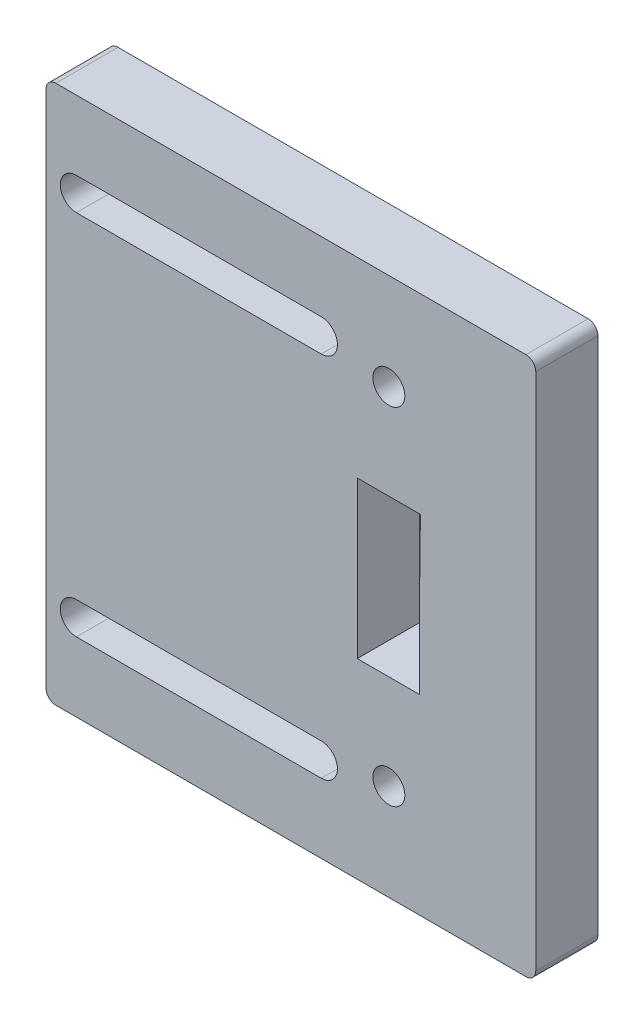
ISO-10303-21;
HEADER;
FILE_DESCRIPTION(('STEP AP214'),'2;1');
FILE_NAME('part.step','',(''),(''),'','','');
FILE_SCHEMA(('AUTOMOTIVE_DESIGN { 1 0 10303 214 1 1 1 1 }'));
ENDSEC;
DATA;
#1=APPLICATION_CONTEXT('core data for automotive mechanical design processes');
#2=APPLICATION_PROTOCOL_DEFINITION('international standard','automotive_design',2000,#1);
#3=PRODUCT_CONTEXT('',#1,'mechanical');
#4=PRODUCT('Part','Part','',(#3));
#5=PRODUCT_RELATED_PRODUCT_CATEGORY('part','',(#4));
#6=PRODUCT_DEFINITION_FORMATION('','',#4);
#7=PRODUCT_DEFINITION_CONTEXT('part definition',#1,'design');
#8=PRODUCT_DEFINITION('design','',#6,#7);
#9=PRODUCT_DEFINITION_SHAPE('','',#8);
#10=(LENGTH_UNIT() NAMED_UNIT(*) SI_UNIT(.MILLI.,.METRE.));
#11=(NAMED_UNIT(*) PLANE_ANGLE_UNIT() SI_UNIT($,.RADIAN.));
#12=(NAMED_UNIT(*) SI_UNIT($,.STERADIAN.) SOLID_ANGLE_UNIT());
#13=UNCERTAINTY_MEASURE_WITH_UNIT(LENGTH_MEASURE(1.E-05),#10,'distance_accuracy_value','');
#14=(GEOMETRIC_REPRESENTATION_CONTEXT(3) GLOBAL_UNCERTAINTY_ASSIGNED_CONTEXT((#13)) GLOBAL_UNIT_ASSIGNED_CONTEXT((#10,
#11,#12)) REPRESENTATION_CONTEXT('',''));
#15=CARTESIAN_POINT('',(0.,0.,0.));
#16=DIRECTION('',(0.,0.,1.));
#17=DIRECTION('',(1.,0.,0.));
#18=AXIS2_PLACEMENT_3D('',#15,#16,#17);
#19=CARTESIAN_POINT('',(0.,0.,12.7));
#20=DIRECTION('',(0.,0.,1.));
#21=DIRECTION('',(1.,0.,0.));
#22=AXIS2_PLACEMENT_3D('',#19,#20,#21);
#23=PLANE('',#22);
#24=CARTESIAN_POINT('',(56.200253658406,-17.49,12.7));
#25=DIRECTION('',(0.,0.,-1.));
#26=DIRECTION('',(1.,0.,0.));
#27=AXIS2_PLACEMENT_3D('',#24,#25,#26);
#28=CIRCLE('',#27,3.3);
#29=CARTESIAN_POINT('',(56.200253658406,-14.19,12.7));
#30=VERTEX_POINT('',#29);
#31=CARTESIAN_POINT('',(56.200253658406,-20.79,12.7));
#32=VERTEX_POINT('',#31);
#33=EDGE_CURVE('E187',#30,#32,#28,.T.);
#34=ORIENTED_EDGE('',*,*,#33,.T.);
#35=DIRECTION('',(-1.,0.,0.));
#36=VECTOR('',#35,1.);
#37=CARTESIAN_POINT('',(56.200253658406,-20.79,12.7));
#38=LINE('',#37,#36);
#39=CARTESIAN_POINT('',(6.20025365840605,-20.79,12.7));
#40=VERTEX_POINT('',#39);
#41=EDGE_CURVE('E199',#32,#40,#38,.T.);
#42=ORIENTED_EDGE('',*,*,#41,.T.);
#43=CARTESIAN_POINT('',(6.20025365840605,-17.49,12.7));
#44=DIRECTION('',(0.,0.,-1.));
#45=DIRECTION('',(1.,0.,0.));
#46=AXIS2_PLACEMENT_3D('',#43,#44,#45);
#47=CIRCLE('',#46,3.3);
#48=CARTESIAN_POINT('',(6.20025365840605,-14.19,12.7));
#49=VERTEX_POINT('',#48);
#50=EDGE_CURVE('E55',#40,#49,#47,.T.);
#51=ORIENTED_EDGE('',*,*,#50,.T.);
#52=DIRECTION('',(1.,0.,0.));
#53=VECTOR('',#52,1.);
#54=CARTESIAN_POINT('',(56.200253658406,-14.19,12.7));
#55=LINE('',#54,#53);
#56=EDGE_CURVE('E196',#49,#30,#55,.T.);
#57=ORIENTED_EDGE('',*,*,#56,.T.);
#58=EDGE_LOOP('',(#34,#42,#51,#57));
#59=FACE_BOUND('',#58,.T.);
#60=CARTESIAN_POINT('',(56.200253658406,-92.51,12.7));
#61=DIRECTION('',(0.,0.,-1.));
#62=DIRECTION('',(-1.,0.,0.));
#63=AXIS2_PLACEMENT_3D('',#60,#61,#62);
#64=CIRCLE('',#63,3.3);
#65=CARTESIAN_POINT('',(56.200253658406,-89.21,12.7));
#66=VERTEX_POINT('',#65);
#67=CARTESIAN_POINT('',(56.200253658406,-95.81,12.7));
#68=VERTEX_POINT('',#67);
#69=EDGE_CURVE('E236',#66,#68,#64,.T.);
#70=ORIENTED_EDGE('',*,*,#69,.T.);
#71=DIRECTION('',(-1.,0.,0.));
#72=VECTOR('',#71,1.);
#73=CARTESIAN_POINT('',(56.200253658406,-95.81,12.7));
#74=LINE('',#73,#72);
#75=CARTESIAN_POINT('',(6.20025365840604,-95.81,12.7));
#76=VERTEX_POINT('',#75);
#77=EDGE_CURVE('E240',#68,#76,#74,.T.);
#78=ORIENTED_EDGE('',*,*,#77,.T.);
#79=CARTESIAN_POINT('',(6.20025365840604,-92.51,12.7));
#80=DIRECTION('',(0.,0.,-1.));
#81=DIRECTION('',(-1.,0.,0.));
#82=AXIS2_PLACEMENT_3D('',#79,#80,#81);
#83=CIRCLE('',#82,3.3);
#84=CARTESIAN_POINT('',(6.20025365840604,-89.21,12.7));
#85=VERTEX_POINT('',#84);
#86=EDGE_CURVE('E63',#76,#85,#83,.T.);
#87=ORIENTED_EDGE('',*,*,#86,.T.);
#88=DIRECTION('',(1.,0.,0.));
#89=VECTOR('',#88,1.);
#90=CARTESIAN_POINT('',(56.200253658406,-89.21,12.7));
#91=LINE('',#90,#89);
#92=EDGE_CURVE('E247',#85,#66,#91,.T.);
#93=ORIENTED_EDGE('',*,*,#92,.T.);
#94=EDGE_LOOP('',(#70,#78,#87,#93));
#95=FACE_BOUND('',#94,.T.);
#96=CARTESIAN_POINT('',(70.,-19.69,12.7));
#97=DIRECTION('',(0.,0.,-1.));
#98=DIRECTION('',(-1.,0.,0.));
#99=AXIS2_PLACEMENT_3D('',#96,#97,#98);
#100=CIRCLE('',#99,3.26389999999999);
#101=CARTESIAN_POINT('',(66.7361,-19.69,12.7));
#102=VERTEX_POINT('',#101);
#103=EDGE_CURVE('E284',#102,#102,#100,.T.);
#104=ORIENTED_EDGE('',*,*,#103,.T.);
#105=EDGE_LOOP('',(#104));
#106=FACE_BOUND('',#105,.T.);
#107=CARTESIAN_POINT('',(70.,-90.31,12.7));
#108=DIRECTION('',(0.,0.,-1.));
#109=DIRECTION('',(-1.,0.,0.));
#110=AXIS2_PLACEMENT_3D('',#107,#108,#109);
#111=CIRCLE('',#110,3.26389999999999);
#112=CARTESIAN_POINT('',(66.7361000000001,-90.31,12.7));
#113=VERTEX_POINT('',#112);
#114=EDGE_CURVE('E296',#113,#113,#111,.T.);
#115=ORIENTED_EDGE('',*,*,#114,.T.);
#116=EDGE_LOOP('',(#115));
#117=FACE_BOUND('',#116,.T.);
#118=DIRECTION('',(-1.,0.,0.));
#119=VECTOR('',#118,1.);
#120=CARTESIAN_POINT('',(0.,0.,12.7));
#121=LINE('',#120,#119);
#122=CARTESIAN_POINT('',(98.,0.,12.7));
#123=VERTEX_POINT('',#122);
#124=CARTESIAN_POINT('',(2.,0.,12.7));
#125=VERTEX_POINT('',#124);
#126=EDGE_CURVE('E366',#123,#125,#121,.T.);
#127=ORIENTED_EDGE('',*,*,#126,.T.);
#128=CARTESIAN_POINT('',(2.,-2.,12.7));
#129=DIRECTION('',(0.,0.,1.));
#130=DIRECTION('',(1.,0.,0.));
#131=AXIS2_PLACEMENT_3D('',#128,#129,#130);
#132=CIRCLE('',#131,2.);
#133=CARTESIAN_POINT('',(0.,-2.,12.7));
#134=VERTEX_POINT('',#133);
#135=EDGE_CURVE('E419',#125,#134,#132,.T.);
#136=ORIENTED_EDGE('',*,*,#135,.T.);
#137=DIRECTION('',(0.,-1.,0.));
#138=VECTOR('',#137,1.);
#139=CARTESIAN_POINT('',(0.,0.,12.7));
#140=LINE('',#139,#138);
#141=CARTESIAN_POINT('',(0.,-108.,12.7));
#142=VERTEX_POINT('',#141);
#143=EDGE_CURVE('E353',#134,#142,#140,.T.);
#144=ORIENTED_EDGE('',*,*,#143,.T.);
#145=CARTESIAN_POINT('',(2.,-108.,12.7));
#146=DIRECTION('',(0.,0.,1.));
#147=DIRECTION('',(1.,0.,0.));
#148=AXIS2_PLACEMENT_3D('',#145,#146,#147);
#149=CIRCLE('',#148,2.);
#150=CARTESIAN_POINT('',(2.,-110.,12.7));
#151=VERTEX_POINT('',#150);
#152=EDGE_CURVE('E413',#142,#151,#149,.T.);
#153=ORIENTED_EDGE('',*,*,#152,.T.);
#154=DIRECTION('',(1.,0.,0.));
#155=VECTOR('',#154,1.);
#156=CARTESIAN_POINT('',(0.,-110.,12.7));
#157=LINE('',#156,#155);
#158=CARTESIAN_POINT('',(98.,-110.,12.7));
#159=VERTEX_POINT('',#158);
#160=EDGE_CURVE('E357',#151,#159,#157,.T.);
#161=ORIENTED_EDGE('',*,*,#160,.T.);
#162=CARTESIAN_POINT('',(98.,-108.,12.7));
#163=DIRECTION('',(0.,0.,1.));
#164=DIRECTION('',(1.,0.,0.));
#165=AXIS2_PLACEMENT_3D('',#162,#163,#164);
#166=CIRCLE('',#165,2.);
#167=CARTESIAN_POINT('',(100.,-108.,12.7));
#168=VERTEX_POINT('',#167);
#169=EDGE_CURVE('E410',#159,#168,#166,.T.);
#170=ORIENTED_EDGE('',*,*,#169,.T.);
#171=DIRECTION('',(0.,1.,0.));
#172=VECTOR('',#171,1.);
#173=CARTESIAN_POINT('',(100.,0.,12.7));
#174=LINE('',#173,#172);
#175=CARTESIAN_POINT('',(100.,-2.,12.7));
#176=VERTEX_POINT('',#175);
#177=EDGE_CURVE('E362',#168,#176,#174,.T.);
#178=ORIENTED_EDGE('',*,*,#177,.T.);
#179=CARTESIAN_POINT('',(98.,-2.,12.7));
#180=DIRECTION('',(0.,0.,1.));
#181=DIRECTION('',(1.,0.,0.));
#182=AXIS2_PLACEMENT_3D('',#179,#180,#181);
#183=CIRCLE('',#182,2.);
#184=EDGE_CURVE('E416',#176,#123,#183,.T.);
#185=ORIENTED_EDGE('',*,*,#184,.T.);
#186=EDGE_LOOP('',(#127,#136,#144,#153,#161,#170,#178,#185));
#187=FACE_BOUND('',#186,.T.);
#188=DIRECTION('',(1.,0.,0.));
#189=VECTOR('',#188,1.);
#190=CARTESIAN_POINT('',(70.,-70.9756259780908,12.7));
#191=LINE('',#190,#189);
#192=CARTESIAN_POINT('',(63.55,-70.9756259780908,12.7));
#193=VERTEX_POINT('',#192);
#194=CARTESIAN_POINT('',(76.2499999999986,-70.9756259780908,12.7));
#195=VERTEX_POINT('',#194);
#196=EDGE_CURVE('E308',#193,#195,#191,.T.);
#197=ORIENTED_EDGE('',*,*,#196,.F.);
#198=DIRECTION('',(0.,-1.,0.));
#199=VECTOR('',#198,1.);
#200=CARTESIAN_POINT('',(63.55,-70.9756259780908,12.7));
#201=LINE('',#200,#199);
#202=CARTESIAN_POINT('',(63.55,-39.0256259780908,12.7));
#203=VERTEX_POINT('',#202);
#204=EDGE_CURVE('E304',#203,#193,#201,.T.);
#205=ORIENTED_EDGE('',*,*,#204,.F.);
#206=DIRECTION('',(-1.,0.,0.));
#207=VECTOR('',#206,1.);
#208=CARTESIAN_POINT('',(63.55,-39.0256259780908,12.7));
#209=LINE('',#208,#207);
#210=CARTESIAN_POINT('',(76.45,-39.0256259780908,12.7));
#211=VERTEX_POINT('',#210);
#212=EDGE_CURVE('E301',#211,#203,#209,.T.);
#213=ORIENTED_EDGE('',*,*,#212,.F.);
#214=DIRECTION('',(0.0125190712574074,0.999921633356761,0.));
#215=VECTOR('',#214,1.);
#216=CARTESIAN_POINT('',(76.45,-39.0256259780908,12.7));
#217=LINE('',#216,#215);
#218=CARTESIAN_POINT('',(76.2499999999986,-55.,12.7));
#219=VERTEX_POINT('',#218);
#220=EDGE_CURVE('E314',#219,#211,#217,.T.);
#221=ORIENTED_EDGE('',*,*,#220,.F.);
#222=DIRECTION('',(0.,1.,0.));
#223=VECTOR('',#222,1.);
#224=CARTESIAN_POINT('',(76.2499999999986,-55.,12.7));
#225=LINE('',#224,#223);
#226=EDGE_CURVE('E311',#195,#219,#225,.T.);
#227=ORIENTED_EDGE('',*,*,#226,.F.);
#228=EDGE_LOOP('',(#197,#205,#213,#221,#227));
#229=FACE_BOUND('',#228,.T.);
#230=ADVANCED_FACE('F39',(#59,#95,#106,#117,#187,#229),#23,.T.);
#231=CARTESIAN_POINT('',(0.,0.,0.));
#232=DIRECTION('',(0.,0.,1.));
#233=DIRECTION('',(1.,0.,0.));
#234=AXIS2_PLACEMENT_3D('',#231,#232,#233);
#235=PLANE('',#234);
#236=DIRECTION('',(-1.,0.,0.));
#237=VECTOR('',#236,1.);
#238=CARTESIAN_POINT('',(56.200253658406,-20.79,0.));
#239=LINE('',#238,#237);
#240=CARTESIAN_POINT('',(56.200253658406,-20.79,0.));
#241=VERTEX_POINT('',#240);
#242=CARTESIAN_POINT('',(6.20025365840605,-20.79,0.));
#243=VERTEX_POINT('',#242);
#244=EDGE_CURVE('E220',#241,#243,#239,.T.);
#245=ORIENTED_EDGE('',*,*,#244,.F.);
#246=CARTESIAN_POINT('',(56.200253658406,-17.49,0.));
#247=DIRECTION('',(0.,0.,-1.));
#248=DIRECTION('',(1.,0.,0.));
#249=AXIS2_PLACEMENT_3D('',#246,#247,#248);
#250=CIRCLE('',#249,3.3);
#251=CARTESIAN_POINT('',(56.200253658406,-14.19,0.));
#252=VERTEX_POINT('',#251);
#253=EDGE_CURVE('E190',#252,#241,#250,.T.);
#254=ORIENTED_EDGE('',*,*,#253,.F.);
#255=DIRECTION('',(1.,0.,0.));
#256=VECTOR('',#255,1.);
#257=CARTESIAN_POINT('',(56.200253658406,-14.19,0.));
#258=LINE('',#257,#256);
#259=CARTESIAN_POINT('',(6.20025365840605,-14.19,0.));
#260=VERTEX_POINT('',#259);
#261=EDGE_CURVE('E207',#260,#252,#258,.T.);
#262=ORIENTED_EDGE('',*,*,#261,.F.);
#263=CARTESIAN_POINT('',(6.20025365840605,-17.49,0.));
#264=DIRECTION('',(0.,0.,-1.));
#265=DIRECTION('',(1.,0.,0.));
#266=AXIS2_PLACEMENT_3D('',#263,#264,#265);
#267=CIRCLE('',#266,3.3);
#268=EDGE_CURVE('E211',#243,#260,#267,.T.);
#269=ORIENTED_EDGE('',*,*,#268,.F.);
#270=EDGE_LOOP('',(#245,#254,#262,#269));
#271=FACE_BOUND('',#270,.T.);
#272=DIRECTION('',(-1.,0.,0.));
#273=VECTOR('',#272,1.);
#274=CARTESIAN_POINT('',(56.200253658406,-95.81,0.));
#275=LINE('',#274,#273);
#276=CARTESIAN_POINT('',(56.200253658406,-95.81,0.));
#277=VERTEX_POINT('',#276);
#278=CARTESIAN_POINT('',(6.20025365840604,-95.81,0.));
#279=VERTEX_POINT('',#278);
#280=EDGE_CURVE('E255',#277,#279,#275,.T.);
#281=ORIENTED_EDGE('',*,*,#280,.F.);
#282=CARTESIAN_POINT('',(56.200253658406,-92.51,0.));
#283=DIRECTION('',(0.,0.,-1.));
#284=DIRECTION('',(-1.,0.,0.));
#285=AXIS2_PLACEMENT_3D('',#282,#283,#284);
#286=CIRCLE('',#285,3.3);
#287=CARTESIAN_POINT('',(56.200253658406,-89.21,0.));
#288=VERTEX_POINT('',#287);
#289=EDGE_CURVE('E252',#288,#277,#286,.T.);
#290=ORIENTED_EDGE('',*,*,#289,.F.);
#291=DIRECTION('',(1.,0.,0.));
#292=VECTOR('',#291,1.);
#293=CARTESIAN_POINT('',(56.200253658406,-89.21,0.));
#294=LINE('',#293,#292);
#295=CARTESIAN_POINT('',(6.20025365840604,-89.21,0.));
#296=VERTEX_POINT('',#295);
#297=EDGE_CURVE('E241',#296,#288,#294,.T.);
#298=ORIENTED_EDGE('',*,*,#297,.F.);
#299=CARTESIAN_POINT('',(6.20025365840604,-92.51,0.));
#300=DIRECTION('',(0.,0.,-1.));
#301=DIRECTION('',(-1.,0.,0.));
#302=AXIS2_PLACEMENT_3D('',#299,#300,#301);
#303=CIRCLE('',#302,3.3);
#304=EDGE_CURVE('E259',#279,#296,#303,.T.);
#305=ORIENTED_EDGE('',*,*,#304,.F.);
#306=EDGE_LOOP('',(#281,#290,#298,#305));
#307=FACE_BOUND('',#306,.T.);
#308=CARTESIAN_POINT('',(70.,-19.69,0.));
#309=DIRECTION('',(0.,0.,-1.));
#310=DIRECTION('',(-1.,0.,0.));
#311=AXIS2_PLACEMENT_3D('',#308,#309,#310);
#312=CIRCLE('',#311,6.4389);
#313=CARTESIAN_POINT('',(63.5611,-19.69,0.));
#314=VERTEX_POINT('',#313);
#315=EDGE_CURVE('E230',#314,#314,#312,.T.);
#316=ORIENTED_EDGE('',*,*,#315,.F.);
#317=EDGE_LOOP('',(#316));
#318=FACE_BOUND('',#317,.T.);
#319=CARTESIAN_POINT('',(70.,-90.31,0.));
#320=DIRECTION('',(0.,0.,-1.));
#321=DIRECTION('',(-1.,0.,0.));
#322=AXIS2_PLACEMENT_3D('',#319,#320,#321);
#323=CIRCLE('',#322,6.4389);
#324=CARTESIAN_POINT('',(63.5611,-90.31,0.));
#325=VERTEX_POINT('',#324);
#326=EDGE_CURVE('E288',#325,#325,#323,.T.);
#327=ORIENTED_EDGE('',*,*,#326,.F.);
#328=EDGE_LOOP('',(#327));
#329=FACE_BOUND('',#328,.T.);
#330=DIRECTION('',(0.,-1.,0.));
#331=VECTOR('',#330,1.);
#332=CARTESIAN_POINT('',(0.,0.,0.));
#333=LINE('',#332,#331);
#334=CARTESIAN_POINT('',(0.,-2.,0.));
#335=VERTEX_POINT('',#334);
#336=CARTESIAN_POINT('',(0.,-108.,0.));
#337=VERTEX_POINT('',#336);
#338=EDGE_CURVE('E352',#335,#337,#333,.T.);
#339=ORIENTED_EDGE('',*,*,#338,.F.);
#340=CARTESIAN_POINT('',(2.,-2.,0.));
#341=DIRECTION('',(0.,0.,1.));
#342=DIRECTION('',(1.,0.,0.));
#343=AXIS2_PLACEMENT_3D('',#340,#341,#342);
#344=CIRCLE('',#343,2.);
#345=CARTESIAN_POINT('',(2.,0.,0.));
#346=VERTEX_POINT('',#345);
#347=EDGE_CURVE('E400',#335,#346,#344,.F.);
#348=ORIENTED_EDGE('',*,*,#347,.T.);
#349=DIRECTION('',(-1.,0.,0.));
#350=VECTOR('',#349,1.);
#351=CARTESIAN_POINT('',(0.,0.,0.));
#352=LINE('',#351,#350);
#353=CARTESIAN_POINT('',(98.,0.,0.));
#354=VERTEX_POINT('',#353);
#355=EDGE_CURVE('E358',#354,#346,#352,.T.);
#356=ORIENTED_EDGE('',*,*,#355,.F.);
#357=CARTESIAN_POINT('',(98.,-2.,0.));
#358=DIRECTION('',(0.,0.,1.));
#359=DIRECTION('',(1.,0.,0.));
#360=AXIS2_PLACEMENT_3D('',#357,#358,#359);
#361=CIRCLE('',#360,2.);
#362=CARTESIAN_POINT('',(100.,-2.,0.));
#363=VERTEX_POINT('',#362);
#364=EDGE_CURVE('E397',#354,#363,#361,.F.);
#365=ORIENTED_EDGE('',*,*,#364,.T.);
#366=DIRECTION('',(0.,1.,0.));
#367=VECTOR('',#366,1.);
#368=CARTESIAN_POINT('',(100.,0.,0.));
#369=LINE('',#368,#367);
#370=CARTESIAN_POINT('',(100.,-108.,0.));
#371=VERTEX_POINT('',#370);
#372=EDGE_CURVE('E378',#371,#363,#369,.T.);
#373=ORIENTED_EDGE('',*,*,#372,.F.);
#374=CARTESIAN_POINT('',(98.,-108.,0.));
#375=DIRECTION('',(0.,0.,1.));
#376=DIRECTION('',(1.,0.,0.));
#377=AXIS2_PLACEMENT_3D('',#374,#375,#376);
#378=CIRCLE('',#377,2.);
#379=CARTESIAN_POINT('',(98.,-110.,0.));
#380=VERTEX_POINT('',#379);
#381=EDGE_CURVE('E391',#371,#380,#378,.F.);
#382=ORIENTED_EDGE('',*,*,#381,.T.);
#383=DIRECTION('',(1.,0.,0.));
#384=VECTOR('',#383,1.);
#385=CARTESIAN_POINT('',(0.,-110.,0.));
#386=LINE('',#385,#384);
#387=CARTESIAN_POINT('',(2.,-110.,0.));
#388=VERTEX_POINT('',#387);
#389=EDGE_CURVE('E374',#388,#380,#386,.T.);
#390=ORIENTED_EDGE('',*,*,#389,.F.);
#391=CARTESIAN_POINT('',(2.,-108.,0.));
#392=DIRECTION('',(0.,0.,1.));
#393=DIRECTION('',(1.,0.,0.));
#394=AXIS2_PLACEMENT_3D('',#391,#392,#393);
#395=CIRCLE('',#394,2.);
#396=EDGE_CURVE('E394',#388,#337,#395,.F.);
#397=ORIENTED_EDGE('',*,*,#396,.T.);
#398=EDGE_LOOP('',(#339,#348,#356,#365,#373,#382,#390,#397));
#399=FACE_BOUND('',#398,.T.);
#400=DIRECTION('',(0.,-1.,0.));
#401=VECTOR('',#400,1.);
#402=CARTESIAN_POINT('',(63.55,-70.9756259780908,0.));
#403=LINE('',#402,#401);
#404=CARTESIAN_POINT('',(63.55,-39.0256259780908,0.));
#405=VERTEX_POINT('',#404);
#406=CARTESIAN_POINT('',(63.55,-70.9756259780908,0.));
#407=VERTEX_POINT('',#406);
#408=EDGE_CURVE('E300',#405,#407,#403,.T.);
#409=ORIENTED_EDGE('',*,*,#408,.T.);
#410=DIRECTION('',(1.,0.,0.));
#411=VECTOR('',#410,1.);
#412=CARTESIAN_POINT('',(76.2499999999986,-70.9756259780908,0.));
#413=LINE('',#412,#411);
#414=CARTESIAN_POINT('',(76.2499999999986,-70.9756259780908,0.));
#415=VERTEX_POINT('',#414);
#416=EDGE_CURVE('E322',#407,#415,#413,.T.);
#417=ORIENTED_EDGE('',*,*,#416,.T.);
#418=DIRECTION('',(0.,1.,0.));
#419=VECTOR('',#418,1.);
#420=CARTESIAN_POINT('',(76.2499999999986,-55.,0.));
#421=LINE('',#420,#419);
#422=CARTESIAN_POINT('',(76.2499999999986,-55.,0.));
#423=VERTEX_POINT('',#422);
#424=EDGE_CURVE('E326',#415,#423,#421,.T.);
#425=ORIENTED_EDGE('',*,*,#424,.T.);
#426=DIRECTION('',(0.0125190712574074,0.999921633356761,0.));
#427=VECTOR('',#426,1.);
#428=CARTESIAN_POINT('',(76.45,-39.0256259780908,0.));
#429=LINE('',#428,#427);
#430=CARTESIAN_POINT('',(76.45,-39.0256259780908,0.));
#431=VERTEX_POINT('',#430);
#432=EDGE_CURVE('E330',#423,#431,#429,.T.);
#433=ORIENTED_EDGE('',*,*,#432,.T.);
#434=DIRECTION('',(-1.,0.,0.));
#435=VECTOR('',#434,1.);
#436=CARTESIAN_POINT('',(70.,-39.0256259780908,0.));
#437=LINE('',#436,#435);
#438=EDGE_CURVE('E305',#431,#405,#437,.T.);
#439=ORIENTED_EDGE('',*,*,#438,.T.);
#440=EDGE_LOOP('',(#409,#417,#425,#433,#439));
#441=FACE_BOUND('',#440,.T.);
#442=ADVANCED_FACE('F448',(#271,#307,#318,#329,#399,#441),#235,.F.);
#443=CARTESIAN_POINT('',(0.,0.,12.7));
#444=DIRECTION('',(1.,0.,0.));
#445=DIRECTION('',(0.,0.,-1.));
#446=AXIS2_PLACEMENT_3D('',#443,#444,#445);
#447=PLANE('',#446);
#448=ORIENTED_EDGE('',*,*,#143,.F.);
#449=DIRECTION('',(0.,0.,-1.));
#450=VECTOR('',#449,1.);
#451=CARTESIAN_POINT('',(0.,-2.,12.7));
#452=LINE('',#451,#450);
#453=EDGE_CURVE('E387',#134,#335,#452,.T.);
#454=ORIENTED_EDGE('',*,*,#453,.T.);
#455=ORIENTED_EDGE('',*,*,#338,.T.);
#456=DIRECTION('',(0.,0.,-1.));
#457=VECTOR('',#456,1.);
#458=CARTESIAN_POINT('',(0.,-108.,12.7));
#459=LINE('',#458,#457);
#460=EDGE_CURVE('E370',#337,#142,#459,.F.);
#461=ORIENTED_EDGE('',*,*,#460,.T.);
#462=EDGE_LOOP('',(#448,#454,#455,#461));
#463=FACE_BOUND('',#462,.T.);
#464=ADVANCED_FACE('F465',(#463),#447,.F.);
#465=CARTESIAN_POINT('',(0.,-110.,12.7));
#466=DIRECTION('',(0.,1.,0.));
#467=DIRECTION('',(0.,0.,1.));
#468=AXIS2_PLACEMENT_3D('',#465,#466,#467);
#469=PLANE('',#468);
#470=ORIENTED_EDGE('',*,*,#160,.F.);
#471=DIRECTION('',(0.,0.,-1.));
#472=VECTOR('',#471,1.);
#473=CARTESIAN_POINT('',(2.,-110.,12.7));
#474=LINE('',#473,#472);
#475=EDGE_CURVE('E11',#151,#388,#474,.T.);
#476=ORIENTED_EDGE('',*,*,#475,.T.);
#477=ORIENTED_EDGE('',*,*,#389,.T.);
#478=DIRECTION('',(0.,0.,-1.));
#479=VECTOR('',#478,1.);
#480=CARTESIAN_POINT('',(98.,-110.,12.7));
#481=LINE('',#480,#479);
#482=EDGE_CURVE('E48',#380,#159,#481,.F.);
#483=ORIENTED_EDGE('',*,*,#482,.T.);
#484=EDGE_LOOP('',(#470,#476,#477,#483));
#485=FACE_BOUND('',#484,.T.);
#486=ADVANCED_FACE('F432',(#485),#469,.F.);
#487=CARTESIAN_POINT('',(100.,0.,12.7));
#488=DIRECTION('',(-1.,0.,0.));
#489=DIRECTION('',(0.,-1.,0.));
#490=AXIS2_PLACEMENT_3D('',#487,#488,#489);
#491=PLANE('',#490);
#492=ORIENTED_EDGE('',*,*,#372,.T.);
#493=DIRECTION('',(0.,0.,-1.));
#494=VECTOR('',#493,1.);
#495=CARTESIAN_POINT('',(100.,-2.,12.7));
#496=LINE('',#495,#494);
#497=EDGE_CURVE('E426',#363,#176,#496,.F.);
#498=ORIENTED_EDGE('',*,*,#497,.T.);
#499=ORIENTED_EDGE('',*,*,#177,.F.);
#500=DIRECTION('',(0.,0.,-1.));
#501=VECTOR('',#500,1.);
#502=CARTESIAN_POINT('',(100.,-108.,12.7));
#503=LINE('',#502,#501);
#504=EDGE_CURVE('E422',#168,#371,#503,.T.);
#505=ORIENTED_EDGE('',*,*,#504,.T.);
#506=EDGE_LOOP('',(#492,#498,#499,#505));
#507=FACE_BOUND('',#506,.T.);
#508=ADVANCED_FACE('F444',(#507),#491,.F.);
#509=CARTESIAN_POINT('',(0.,0.,12.7));
#510=DIRECTION('',(0.,-1.,0.));
#511=DIRECTION('',(0.,0.,-1.));
#512=AXIS2_PLACEMENT_3D('',#509,#510,#511);
#513=PLANE('',#512);
#514=ORIENTED_EDGE('',*,*,#355,.T.);
#515=DIRECTION('',(0.,0.,-1.));
#516=VECTOR('',#515,1.);
#517=CARTESIAN_POINT('',(2.,0.,12.7));
#518=LINE('',#517,#516);
#519=EDGE_CURVE('E407',#346,#125,#518,.F.);
#520=ORIENTED_EDGE('',*,*,#519,.T.);
#521=ORIENTED_EDGE('',*,*,#126,.F.);
#522=DIRECTION('',(0.,0.,-1.));
#523=VECTOR('',#522,1.);
#524=CARTESIAN_POINT('',(98.,0.,12.7));
#525=LINE('',#524,#523);
#526=EDGE_CURVE('E403',#123,#354,#525,.T.);
#527=ORIENTED_EDGE('',*,*,#526,.T.);
#528=EDGE_LOOP('',(#514,#520,#521,#527));
#529=FACE_BOUND('',#528,.T.);
#530=ADVANCED_FACE('F457',(#529),#513,.F.);
#531=CARTESIAN_POINT('',(63.55,-70.9756259780908,12.7));
#532=DIRECTION('',(1.,0.,0.));
#533=DIRECTION('',(0.,0.,-1.));
#534=AXIS2_PLACEMENT_3D('',#531,#532,#533);
#535=PLANE('',#534);
#536=ORIENTED_EDGE('',*,*,#408,.F.);
#537=DIRECTION('',(0.,0.,-1.));
#538=VECTOR('',#537,1.);
#539=CARTESIAN_POINT('',(63.55,-39.0256259780908,12.7));
#540=LINE('',#539,#538);
#541=EDGE_CURVE('E349',#203,#405,#540,.T.);
#542=ORIENTED_EDGE('',*,*,#541,.F.);
#543=ORIENTED_EDGE('',*,*,#204,.T.);
#544=DIRECTION('',(0.,0.,-1.));
#545=VECTOR('',#544,1.);
#546=CARTESIAN_POINT('',(63.55,-70.9756259780908,12.7));
#547=LINE('',#546,#545);
#548=EDGE_CURVE('E345',#193,#407,#547,.T.);
#549=ORIENTED_EDGE('',*,*,#548,.T.);
#550=EDGE_LOOP('',(#536,#542,#543,#549));
#551=FACE_BOUND('',#550,.T.);
#552=ADVANCED_FACE('F484',(#551),#535,.T.);
#553=CARTESIAN_POINT('',(76.2499999999986,-70.9756259780908,12.7));
#554=DIRECTION('',(0.,1.,0.));
#555=DIRECTION('',(-1.,0.,0.));
#556=AXIS2_PLACEMENT_3D('',#553,#554,#555);
#557=PLANE('',#556);
#558=ORIENTED_EDGE('',*,*,#416,.F.);
#559=ORIENTED_EDGE('',*,*,#548,.F.);
#560=ORIENTED_EDGE('',*,*,#196,.T.);
#561=DIRECTION('',(0.,0.,-1.));
#562=VECTOR('',#561,1.);
#563=CARTESIAN_POINT('',(76.2499999999986,-70.9756259780908,12.7));
#564=LINE('',#563,#562);
#565=EDGE_CURVE('E342',#195,#415,#564,.T.);
#566=ORIENTED_EDGE('',*,*,#565,.T.);
#567=EDGE_LOOP('',(#558,#559,#560,#566));
#568=FACE_BOUND('',#567,.T.);
#569=ADVANCED_FACE('F531',(#568),#557,.T.);
#570=CARTESIAN_POINT('',(76.2499999999986,-55.,12.7));
#571=DIRECTION('',(-1.,0.,0.));
#572=DIRECTION('',(0.,0.,1.));
#573=AXIS2_PLACEMENT_3D('',#570,#571,#572);
#574=PLANE('',#573);
#575=ORIENTED_EDGE('',*,*,#424,.F.);
#576=ORIENTED_EDGE('',*,*,#565,.F.);
#577=ORIENTED_EDGE('',*,*,#226,.T.);
#578=DIRECTION('',(0.,0.,-1.));
#579=VECTOR('',#578,1.);
#580=CARTESIAN_POINT('',(76.2499999999986,-55.,12.7));
#581=LINE('',#580,#579);
#582=EDGE_CURVE('E339',#219,#423,#581,.T.);
#583=ORIENTED_EDGE('',*,*,#582,.T.);
#584=EDGE_LOOP('',(#575,#576,#577,#583));
#585=FACE_BOUND('',#584,.T.);
#586=ADVANCED_FACE('F528',(#585),#574,.T.);
#587=CARTESIAN_POINT('',(76.45,-39.0256259780908,12.7));
#588=DIRECTION('',(-0.999921633356761,0.0125190712574074,0.));
#589=DIRECTION('',(-0.0125190712574074,-0.999921633356761,0.));
#590=AXIS2_PLACEMENT_3D('',#587,#588,#589);
#591=PLANE('',#590);
#592=ORIENTED_EDGE('',*,*,#432,.F.);
#593=ORIENTED_EDGE('',*,*,#582,.F.);
#594=ORIENTED_EDGE('',*,*,#220,.T.);
#595=DIRECTION('',(0.,0.,-1.));
#596=VECTOR('',#595,1.);
#597=CARTESIAN_POINT('',(76.45,-39.0256259780908,12.7));
#598=LINE('',#597,#596);
#599=EDGE_CURVE('E318',#211,#431,#598,.T.);
#600=ORIENTED_EDGE('',*,*,#599,.T.);
#601=EDGE_LOOP('',(#592,#593,#594,#600));
#602=FACE_BOUND('',#601,.T.);
#603=ADVANCED_FACE('F524',(#602),#591,.T.);
#604=CARTESIAN_POINT('',(70.,-39.0256259780908,12.7));
#605=DIRECTION('',(0.,-1.,0.));
#606=DIRECTION('',(0.,0.,-1.));
#607=AXIS2_PLACEMENT_3D('',#604,#605,#606);
#608=PLANE('',#607);
#609=ORIENTED_EDGE('',*,*,#438,.F.);
#610=ORIENTED_EDGE('',*,*,#599,.F.);
#611=ORIENTED_EDGE('',*,*,#212,.T.);
#612=ORIENTED_EDGE('',*,*,#541,.T.);
#613=EDGE_LOOP('',(#609,#610,#611,#612));
#614=FACE_BOUND('',#613,.T.);
#615=ADVANCED_FACE('F520',(#614),#608,.T.);
#616=CARTESIAN_POINT('',(70.,-90.31,0.));
#617=DIRECTION('',(0.,0.,-1.));
#618=DIRECTION('',(-1.,0.,0.));
#619=AXIS2_PLACEMENT_3D('',#616,#617,#618);
#620=CYLINDRICAL_SURFACE('',#619,3.26389999999999);
#621=ORIENTED_EDGE('',*,*,#114,.F.);
#622=EDGE_LOOP('',(#621));
#623=FACE_BOUND('',#622,.T.);
#624=CARTESIAN_POINT('',(70.,-90.31,3.65241969292671));
#625=DIRECTION('',(0.,0.,-1.));
#626=DIRECTION('',(-1.,0.,0.));
#627=AXIS2_PLACEMENT_3D('',#624,#625,#626);
#628=CIRCLE('',#627,3.26389999999999);
#629=CARTESIAN_POINT('',(66.7361000000001,-90.31,3.65241969292671));
#630=VERTEX_POINT('',#629);
#631=EDGE_CURVE('E292',#630,#630,#628,.T.);
#632=ORIENTED_EDGE('',*,*,#631,.T.);
#633=EDGE_LOOP('',(#632));
#634=FACE_BOUND('',#633,.T.);
#635=ADVANCED_FACE('F516',(#623,#634),#620,.F.);
#636=CARTESIAN_POINT('',(70.,-90.31,0.));
#637=DIRECTION('',(0.,0.,-1.));
#638=DIRECTION('',(-1.,0.,0.));
#639=AXIS2_PLACEMENT_3D('',#636,#637,#638);
#640=CONICAL_SURFACE('',#639,6.4389,0.715584993317677);
#641=ORIENTED_EDGE('',*,*,#631,.F.);
#642=EDGE_LOOP('',(#641));
#643=FACE_BOUND('',#642,.T.);
#644=ORIENTED_EDGE('',*,*,#326,.T.);
#645=EDGE_LOOP('',(#644));
#646=FACE_BOUND('',#645,.T.);
#647=ADVANCED_FACE('F506',(#643,#646),#640,.F.);
#648=CARTESIAN_POINT('',(70.,-19.69,0.));
#649=DIRECTION('',(0.,0.,-1.));
#650=DIRECTION('',(-1.,0.,0.));
#651=AXIS2_PLACEMENT_3D('',#648,#649,#650);
#652=CYLINDRICAL_SURFACE('',#651,3.26389999999999);
#653=ORIENTED_EDGE('',*,*,#103,.F.);
#654=EDGE_LOOP('',(#653));
#655=FACE_BOUND('',#654,.T.);
#656=CARTESIAN_POINT('',(70.,-19.69,3.65241969292671));
#657=DIRECTION('',(0.,0.,-1.));
#658=DIRECTION('',(-1.,0.,0.));
#659=AXIS2_PLACEMENT_3D('',#656,#657,#658);
#660=CIRCLE('',#659,3.26389999999999);
#661=CARTESIAN_POINT('',(66.7361,-19.69,3.65241969292671));
#662=VERTEX_POINT('',#661);
#663=EDGE_CURVE('E280',#662,#662,#660,.T.);
#664=ORIENTED_EDGE('',*,*,#663,.T.);
#665=EDGE_LOOP('',(#664));
#666=FACE_BOUND('',#665,.T.);
#667=ADVANCED_FACE('F500',(#655,#666),#652,.F.);
#668=CARTESIAN_POINT('',(70.,-19.69,0.));
#669=DIRECTION('',(0.,0.,-1.));
#670=DIRECTION('',(-1.,0.,0.));
#671=AXIS2_PLACEMENT_3D('',#668,#669,#670);
#672=CONICAL_SURFACE('',#671,6.4389,0.715584993317677);
#673=ORIENTED_EDGE('',*,*,#663,.F.);
#674=EDGE_LOOP('',(#673));
#675=FACE_BOUND('',#674,.T.);
#676=ORIENTED_EDGE('',*,*,#315,.T.);
#677=EDGE_LOOP('',(#676));
#678=FACE_BOUND('',#677,.T.);
#679=ADVANCED_FACE('F496',(#675,#678),#672,.F.);
#680=CARTESIAN_POINT('',(2.,-2.,12.7));
#681=DIRECTION('',(0.,0.,-1.));
#682=DIRECTION('',(-1.,0.,0.));
#683=AXIS2_PLACEMENT_3D('',#680,#681,#682);
#684=CYLINDRICAL_SURFACE('',#683,2.);
#685=ORIENTED_EDGE('',*,*,#135,.F.);
#686=ORIENTED_EDGE('',*,*,#519,.F.);
#687=ORIENTED_EDGE('',*,*,#347,.F.);
#688=ORIENTED_EDGE('',*,*,#453,.F.);
#689=EDGE_LOOP('',(#685,#686,#687,#688));
#690=FACE_BOUND('',#689,.T.);
#691=ADVANCED_FACE('F463',(#690),#684,.T.);
#692=CARTESIAN_POINT('',(98.,-2.,12.7));
#693=DIRECTION('',(0.,0.,-1.));
#694=DIRECTION('',(-1.,0.,0.));
#695=AXIS2_PLACEMENT_3D('',#692,#693,#694);
#696=CYLINDRICAL_SURFACE('',#695,2.);
#697=ORIENTED_EDGE('',*,*,#184,.F.);
#698=ORIENTED_EDGE('',*,*,#497,.F.);
#699=ORIENTED_EDGE('',*,*,#364,.F.);
#700=ORIENTED_EDGE('',*,*,#526,.F.);
#701=EDGE_LOOP('',(#697,#698,#699,#700));
#702=FACE_BOUND('',#701,.T.);
#703=ADVANCED_FACE('F454',(#702),#696,.T.);
#704=CARTESIAN_POINT('',(2.,-108.,12.7));
#705=DIRECTION('',(0.,0.,-1.));
#706=DIRECTION('',(-1.,0.,0.));
#707=AXIS2_PLACEMENT_3D('',#704,#705,#706);
#708=CYLINDRICAL_SURFACE('',#707,2.);
#709=ORIENTED_EDGE('',*,*,#152,.F.);
#710=ORIENTED_EDGE('',*,*,#460,.F.);
#711=ORIENTED_EDGE('',*,*,#396,.F.);
#712=ORIENTED_EDGE('',*,*,#475,.F.);
#713=EDGE_LOOP('',(#709,#710,#711,#712));
#714=FACE_BOUND('',#713,.T.);
#715=ADVANCED_FACE('F468',(#714),#708,.T.);
#716=CARTESIAN_POINT('',(98.,-108.,12.7));
#717=DIRECTION('',(0.,0.,-1.));
#718=DIRECTION('',(-1.,0.,0.));
#719=AXIS2_PLACEMENT_3D('',#716,#717,#718);
#720=CYLINDRICAL_SURFACE('',#719,2.);
#721=ORIENTED_EDGE('',*,*,#169,.F.);
#722=ORIENTED_EDGE('',*,*,#482,.F.);
#723=ORIENTED_EDGE('',*,*,#381,.F.);
#724=ORIENTED_EDGE('',*,*,#504,.F.);
#725=EDGE_LOOP('',(#721,#722,#723,#724));
#726=FACE_BOUND('',#725,.T.);
#727=ADVANCED_FACE('F41',(#726),#720,.T.);
#728=CARTESIAN_POINT('',(56.200253658406,-92.51,12.7));
#729=DIRECTION('',(0.,0.,-1.));
#730=DIRECTION('',(-1.,0.,0.));
#731=AXIS2_PLACEMENT_3D('',#728,#729,#730);
#732=CYLINDRICAL_SURFACE('',#731,3.3);
#733=ORIENTED_EDGE('',*,*,#289,.T.);
#734=DIRECTION('',(0.,0.,-1.));
#735=VECTOR('',#734,1.);
#736=CARTESIAN_POINT('',(56.200253658406,-95.81,12.7));
#737=LINE('',#736,#735);
#738=EDGE_CURVE('E251',#68,#277,#737,.T.);
#739=ORIENTED_EDGE('',*,*,#738,.F.);
#740=ORIENTED_EDGE('',*,*,#69,.F.);
#741=DIRECTION('',(0.,0.,-1.));
#742=VECTOR('',#741,1.);
#743=CARTESIAN_POINT('',(56.200253658406,-89.21,12.7));
#744=LINE('',#743,#742);
#745=EDGE_CURVE('E221',#66,#288,#744,.T.);
#746=ORIENTED_EDGE('',*,*,#745,.T.);
#747=EDGE_LOOP('',(#733,#739,#740,#746));
#748=FACE_BOUND('',#747,.T.);
#749=ADVANCED_FACE('F474',(#748),#732,.F.);
#750=CARTESIAN_POINT('',(56.200253658406,-89.21,12.7));
#751=DIRECTION('',(0.,1.,0.));
#752=DIRECTION('',(-1.,0.,0.));
#753=AXIS2_PLACEMENT_3D('',#750,#751,#752);
#754=PLANE('',#753);
#755=ORIENTED_EDGE('',*,*,#297,.T.);
#756=ORIENTED_EDGE('',*,*,#745,.F.);
#757=ORIENTED_EDGE('',*,*,#92,.F.);
#758=DIRECTION('',(0.,0.,-1.));
#759=VECTOR('',#758,1.);
#760=CARTESIAN_POINT('',(6.20025365840604,-89.21,12.7));
#761=LINE('',#760,#759);
#762=EDGE_CURVE('E268',#85,#296,#761,.T.);
#763=ORIENTED_EDGE('',*,*,#762,.T.);
#764=EDGE_LOOP('',(#755,#756,#757,#763));
#765=FACE_BOUND('',#764,.T.);
#766=ADVANCED_FACE('F586',(#765),#754,.F.);
#767=CARTESIAN_POINT('',(6.20025365840604,-92.51,12.7));
#768=DIRECTION('',(0.,0.,-1.));
#769=DIRECTION('',(-1.,0.,0.));
#770=AXIS2_PLACEMENT_3D('',#767,#768,#769);
#771=CYLINDRICAL_SURFACE('',#770,3.3);
#772=ORIENTED_EDGE('',*,*,#304,.T.);
#773=ORIENTED_EDGE('',*,*,#762,.F.);
#774=ORIENTED_EDGE('',*,*,#86,.F.);
#775=DIRECTION('',(0.,0.,-1.));
#776=VECTOR('',#775,1.);
#777=CARTESIAN_POINT('',(6.20025365840604,-95.81,12.7));
#778=LINE('',#777,#776);
#779=EDGE_CURVE('E271',#76,#279,#778,.T.);
#780=ORIENTED_EDGE('',*,*,#779,.T.);
#781=EDGE_LOOP('',(#772,#773,#774,#780));
#782=FACE_BOUND('',#781,.T.);
#783=ADVANCED_FACE('F596',(#782),#771,.F.);
#784=CARTESIAN_POINT('',(56.200253658406,-95.81,12.7));
#785=DIRECTION('',(0.,-1.,0.));
#786=DIRECTION('',(0.,0.,-1.));
#787=AXIS2_PLACEMENT_3D('',#784,#785,#786);
#788=PLANE('',#787);
#789=ORIENTED_EDGE('',*,*,#280,.T.);
#790=ORIENTED_EDGE('',*,*,#779,.F.);
#791=ORIENTED_EDGE('',*,*,#77,.F.);
#792=ORIENTED_EDGE('',*,*,#738,.T.);
#793=EDGE_LOOP('',(#789,#790,#791,#792));
#794=FACE_BOUND('',#793,.T.);
#795=ADVANCED_FACE('F606',(#794),#788,.F.);
#796=CARTESIAN_POINT('',(56.200253658406,-17.49,12.7));
#797=DIRECTION('',(0.,0.,-1.));
#798=DIRECTION('',(-1.,0.,0.));
#799=AXIS2_PLACEMENT_3D('',#796,#797,#798);
#800=CYLINDRICAL_SURFACE('',#799,3.3);
#801=ORIENTED_EDGE('',*,*,#253,.T.);
#802=DIRECTION('',(0.,0.,-1.));
#803=VECTOR('',#802,1.);
#804=CARTESIAN_POINT('',(56.200253658406,-20.79,12.7));
#805=LINE('',#804,#803);
#806=EDGE_CURVE('E183',#32,#241,#805,.T.);
#807=ORIENTED_EDGE('',*,*,#806,.F.);
#808=ORIENTED_EDGE('',*,*,#33,.F.);
#809=DIRECTION('',(0.,0.,-1.));
#810=VECTOR('',#809,1.);
#811=CARTESIAN_POINT('',(56.200253658406,-14.19,12.7));
#812=LINE('',#811,#810);
#813=EDGE_CURVE('E227',#30,#252,#812,.T.);
#814=ORIENTED_EDGE('',*,*,#813,.T.);
#815=EDGE_LOOP('',(#801,#807,#808,#814));
#816=FACE_BOUND('',#815,.T.);
#817=ADVANCED_FACE('F185',(#816),#800,.F.);
#818=CARTESIAN_POINT('',(56.200253658406,-14.19,12.7));
#819=DIRECTION('',(0.,1.,0.));
#820=DIRECTION('',(0.,0.,1.));
#821=AXIS2_PLACEMENT_3D('',#818,#819,#820);
#822=PLANE('',#821);
#823=ORIENTED_EDGE('',*,*,#261,.T.);
#824=ORIENTED_EDGE('',*,*,#813,.F.);
#825=ORIENTED_EDGE('',*,*,#56,.F.);
#826=DIRECTION('',(0.,0.,-1.));
#827=VECTOR('',#826,1.);
#828=CARTESIAN_POINT('',(6.20025365840605,-14.19,12.7));
#829=LINE('',#828,#827);
#830=EDGE_CURVE('E231',#49,#260,#829,.T.);
#831=ORIENTED_EDGE('',*,*,#830,.T.);
#832=EDGE_LOOP('',(#823,#824,#825,#831));
#833=FACE_BOUND('',#832,.T.);
#834=ADVANCED_FACE('F623',(#833),#822,.F.);
#835=CARTESIAN_POINT('',(6.20025365840605,-17.49,12.7));
#836=DIRECTION('',(0.,0.,-1.));
#837=DIRECTION('',(-1.,0.,0.));
#838=AXIS2_PLACEMENT_3D('',#835,#836,#837);
#839=CYLINDRICAL_SURFACE('',#838,3.3);
#840=ORIENTED_EDGE('',*,*,#268,.T.);
#841=ORIENTED_EDGE('',*,*,#830,.F.);
#842=ORIENTED_EDGE('',*,*,#50,.F.);
#843=DIRECTION('',(0.,0.,-1.));
#844=VECTOR('',#843,1.);
#845=CARTESIAN_POINT('',(6.20025365840605,-20.79,12.7));
#846=LINE('',#845,#844);
#847=EDGE_CURVE('E195',#40,#243,#846,.T.);
#848=ORIENTED_EDGE('',*,*,#847,.T.);
#849=EDGE_LOOP('',(#840,#841,#842,#848));
#850=FACE_BOUND('',#849,.T.);
#851=ADVANCED_FACE('F632',(#850),#839,.F.);
#852=CARTESIAN_POINT('',(56.200253658406,-20.79,12.7));
#853=DIRECTION('',(0.,-1.,0.));
#854=DIRECTION('',(0.,0.,-1.));
#855=AXIS2_PLACEMENT_3D('',#852,#853,#854);
#856=PLANE('',#855);
#857=ORIENTED_EDGE('',*,*,#244,.T.);
#858=ORIENTED_EDGE('',*,*,#847,.F.);
#859=ORIENTED_EDGE('',*,*,#41,.F.);
#860=ORIENTED_EDGE('',*,*,#806,.T.);
#861=EDGE_LOOP('',(#857,#858,#859,#860));
#862=FACE_BOUND('',#861,.T.);
#863=ADVANCED_FACE('F200',(#862),#856,.F.);
#864=CLOSED_SHELL('',(#230,#442,#464,#486,#508,#530,#552,#569,#586,#603,#615,#635,#647,#667,
#679,#691,#703,#715,#727,#749,#766,#783,#795,#817,#834,#851,#863));
#865=MANIFOLD_SOLID_BREP('B2',#864);
#866=ADVANCED_BREP_SHAPE_REPRESENTATION('',(#18,#865),#14);
#867=SHAPE_DEFINITION_REPRESENTATION(#9,#866);
ENDSEC;
END-ISO-10303-21;
